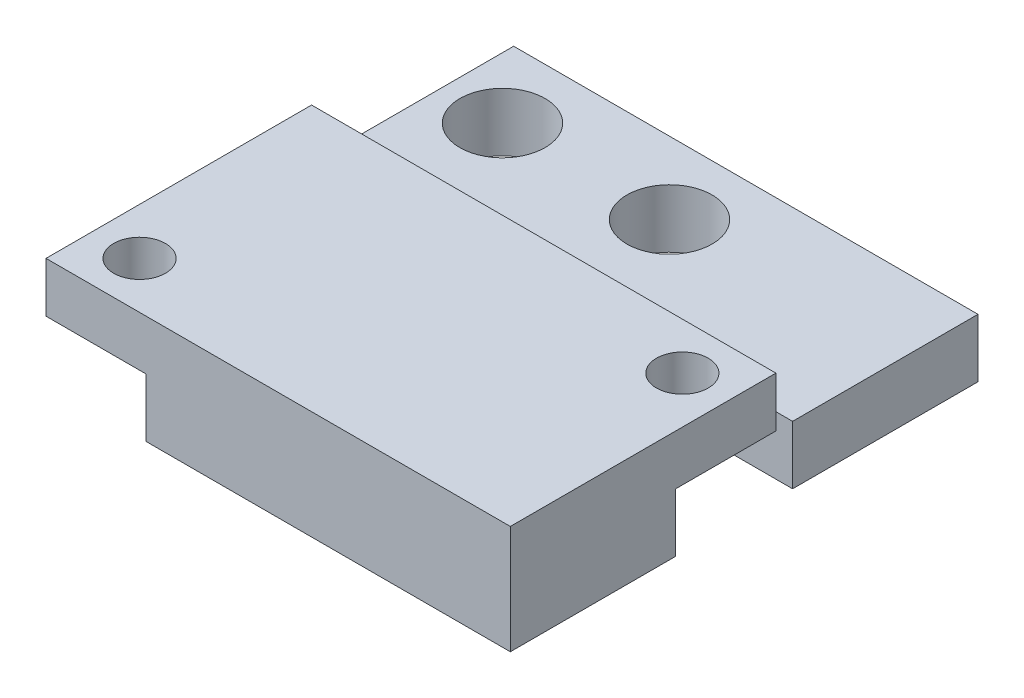
ISO-10303-21;
HEADER;
FILE_DESCRIPTION(('STEP AP214'),'2;1');
FILE_NAME('part.step','',(''),(''),'','','');
FILE_SCHEMA(('AUTOMOTIVE_DESIGN { 1 0 10303 214 1 1 1 1 }'));
ENDSEC;
DATA;
#1=APPLICATION_CONTEXT('core data for automotive mechanical design processes');
#2=APPLICATION_PROTOCOL_DEFINITION('international standard','automotive_design',2000,#1);
#3=PRODUCT_CONTEXT('',#1,'mechanical');
#4=PRODUCT('Part','Part','',(#3));
#5=PRODUCT_RELATED_PRODUCT_CATEGORY('part','',(#4));
#6=PRODUCT_DEFINITION_FORMATION('','',#4);
#7=PRODUCT_DEFINITION_CONTEXT('part definition',#1,'design');
#8=PRODUCT_DEFINITION('design','',#6,#7);
#9=PRODUCT_DEFINITION_SHAPE('','',#8);
#10=(LENGTH_UNIT() NAMED_UNIT(*) SI_UNIT(.MILLI.,.METRE.));
#11=(NAMED_UNIT(*) PLANE_ANGLE_UNIT() SI_UNIT($,.RADIAN.));
#12=(NAMED_UNIT(*) SI_UNIT($,.STERADIAN.) SOLID_ANGLE_UNIT());
#13=UNCERTAINTY_MEASURE_WITH_UNIT(LENGTH_MEASURE(1.E-05),#10,'distance_accuracy_value','');
#14=(GEOMETRIC_REPRESENTATION_CONTEXT(3) GLOBAL_UNCERTAINTY_ASSIGNED_CONTEXT((#13)) GLOBAL_UNIT_ASSIGNED_CONTEXT((#10,
#11,#12)) REPRESENTATION_CONTEXT('',''));
#15=CARTESIAN_POINT('',(0.,0.,0.));
#16=DIRECTION('',(0.,0.,1.));
#17=DIRECTION('',(1.,0.,0.));
#18=AXIS2_PLACEMENT_3D('',#15,#16,#17);
#19=CARTESIAN_POINT('',(0.,3.5,0.));
#20=DIRECTION('',(0.,-1.,0.));
#21=DIRECTION('',(0.,0.,-1.));
#22=AXIS2_PLACEMENT_3D('',#19,#20,#21);
#23=PLANE('',#22);
#24=CARTESIAN_POINT('',(3.65,3.5,-23.68));
#25=DIRECTION('',(0.,1.,0.));
#26=DIRECTION('',(0.,0.,1.));
#27=AXIS2_PLACEMENT_3D('',#24,#25,#26);
#28=CIRCLE('',#27,2.55);
#29=CARTESIAN_POINT('',(3.65,3.5,-21.13));
#30=VERTEX_POINT('',#29);
#31=EDGE_CURVE('E262',#30,#30,#28,.T.);
#32=ORIENTED_EDGE('',*,*,#31,.F.);
#33=EDGE_LOOP('',(#32));
#34=FACE_BOUND('',#33,.T.);
#35=CARTESIAN_POINT('',(13.65,3.5,-23.68));
#36=DIRECTION('',(0.,1.,0.));
#37=DIRECTION('',(0.,0.,1.));
#38=AXIS2_PLACEMENT_3D('',#35,#36,#37);
#39=CIRCLE('',#38,2.55);
#40=CARTESIAN_POINT('',(13.65,3.5,-21.13));
#41=VERTEX_POINT('',#40);
#42=EDGE_CURVE('E270',#41,#41,#39,.T.);
#43=ORIENTED_EDGE('',*,*,#42,.F.);
#44=EDGE_LOOP('',(#43));
#45=FACE_BOUND('',#44,.T.);
#46=DIRECTION('',(0.,0.,1.));
#47=VECTOR('',#46,1.);
#48=CARTESIAN_POINT('',(21.8,3.5,0.));
#49=LINE('',#48,#47);
#50=CARTESIAN_POINT('',(21.8,3.5,-16.9));
#51=VERTEX_POINT('',#50);
#52=CARTESIAN_POINT('',(21.8,3.5,-15.9));
#53=VERTEX_POINT('',#52);
#54=EDGE_CURVE('E55',#51,#53,#49,.T.);
#55=ORIENTED_EDGE('',*,*,#54,.F.);
#56=DIRECTION('',(-1.,0.,0.));
#57=VECTOR('',#56,1.);
#58=CARTESIAN_POINT('',(0.,3.5,-16.9));
#59=LINE('',#58,#57);
#60=CARTESIAN_POINT('',(27.8,3.5,-16.9));
#61=VERTEX_POINT('',#60);
#62=EDGE_CURVE('E138',#61,#51,#59,.T.);
#63=ORIENTED_EDGE('',*,*,#62,.F.);
#64=DIRECTION('',(0.,0.,-1.));
#65=VECTOR('',#64,1.);
#66=CARTESIAN_POINT('',(27.8,3.5,0.));
#67=LINE('',#66,#65);
#68=CARTESIAN_POINT('',(27.8,3.5,-28.));
#69=VERTEX_POINT('',#68);
#70=EDGE_CURVE('E281',#61,#69,#67,.T.);
#71=ORIENTED_EDGE('',*,*,#70,.T.);
#72=DIRECTION('',(-1.,0.,0.));
#73=VECTOR('',#72,1.);
#74=CARTESIAN_POINT('',(0.,3.5,-28.));
#75=LINE('',#74,#73);
#76=CARTESIAN_POINT('',(0.,3.5,-28.));
#77=VERTEX_POINT('',#76);
#78=EDGE_CURVE('E285',#69,#77,#75,.T.);
#79=ORIENTED_EDGE('',*,*,#78,.T.);
#80=DIRECTION('',(0.,0.,1.));
#81=VECTOR('',#80,1.);
#82=CARTESIAN_POINT('',(0.,3.5,0.));
#83=LINE('',#82,#81);
#84=CARTESIAN_POINT('',(0.,3.5,-15.9));
#85=VERTEX_POINT('',#84);
#86=EDGE_CURVE('E278',#77,#85,#83,.T.);
#87=ORIENTED_EDGE('',*,*,#86,.T.);
#88=DIRECTION('',(-1.,0.,0.));
#89=VECTOR('',#88,1.);
#90=CARTESIAN_POINT('',(0.,3.5,-15.9));
#91=LINE('',#90,#89);
#92=EDGE_CURVE('E158',#53,#85,#91,.T.);
#93=ORIENTED_EDGE('',*,*,#92,.F.);
#94=EDGE_LOOP('',(#55,#63,#71,#79,#87,#93));
#95=FACE_BOUND('',#94,.T.);
#96=ADVANCED_FACE('F39',(#34,#45,#95),#23,.F.);
#97=CARTESIAN_POINT('',(27.8,3.5,0.));
#98=DIRECTION('',(-1.,0.,0.));
#99=DIRECTION('',(0.,0.,1.));
#100=AXIS2_PLACEMENT_3D('',#97,#98,#99);
#101=PLANE('',#100);
#102=DIRECTION('',(0.,-1.,0.));
#103=VECTOR('',#102,1.);
#104=CARTESIAN_POINT('',(27.8,3.5,-16.9));
#105=LINE('',#104,#103);
#106=CARTESIAN_POINT('',(27.8,0.,-16.9));
#107=VERTEX_POINT('',#106);
#108=EDGE_CURVE('E143',#61,#107,#105,.T.);
#109=ORIENTED_EDGE('',*,*,#108,.T.);
#110=DIRECTION('',(0.,0.,-1.));
#111=VECTOR('',#110,1.);
#112=CARTESIAN_POINT('',(27.8,0.,0.));
#113=LINE('',#112,#111);
#114=CARTESIAN_POINT('',(27.8,0.,-28.));
#115=VERTEX_POINT('',#114);
#116=EDGE_CURVE('E295',#107,#115,#113,.T.);
#117=ORIENTED_EDGE('',*,*,#116,.T.);
#118=DIRECTION('',(0.,-1.,0.));
#119=VECTOR('',#118,1.);
#120=CARTESIAN_POINT('',(27.8,3.5,-28.));
#121=LINE('',#120,#119);
#122=EDGE_CURVE('E305',#69,#115,#121,.T.);
#123=ORIENTED_EDGE('',*,*,#122,.F.);
#124=ORIENTED_EDGE('',*,*,#70,.F.);
#125=EDGE_LOOP('',(#109,#117,#123,#124));
#126=FACE_BOUND('',#125,.T.);
#127=ADVANCED_FACE('F363',(#126),#101,.F.);
#128=CARTESIAN_POINT('',(0.,0.,0.));
#129=DIRECTION('',(0.,-1.,0.));
#130=DIRECTION('',(0.,0.,-1.));
#131=AXIS2_PLACEMENT_3D('',#128,#129,#130);
#132=PLANE('',#131);
#133=CARTESIAN_POINT('',(13.65,0.,-13.68));
#134=DIRECTION('',(0.,-1.,0.));
#135=DIRECTION('',(0.,0.,-1.));
#136=AXIS2_PLACEMENT_3D('',#133,#134,#135);
#137=CIRCLE('',#136,5.);
#138=CARTESIAN_POINT('',(13.65,0.,-18.68));
#139=VERTEX_POINT('',#138);
#140=EDGE_CURVE('E166',#139,#139,#137,.T.);
#141=ORIENTED_EDGE('',*,*,#140,.F.);
#142=EDGE_LOOP('',(#141));
#143=FACE_BOUND('',#142,.T.);
#144=DIRECTION('',(-1.,0.,0.));
#145=VECTOR('',#144,1.);
#146=CARTESIAN_POINT('',(0.,0.,-9.9));
#147=LINE('',#146,#145);
#148=CARTESIAN_POINT('',(27.8,0.,-9.9));
#149=VERTEX_POINT('',#148);
#150=CARTESIAN_POINT('',(21.8,0.,-9.9));
#151=VERTEX_POINT('',#150);
#152=EDGE_CURVE('E164',#149,#151,#147,.T.);
#153=ORIENTED_EDGE('',*,*,#152,.F.);
#154=CARTESIAN_POINT('',(27.8,0.,0.));
#155=VERTEX_POINT('',#154);
#156=EDGE_CURVE('E296',#155,#149,#113,.T.);
#157=ORIENTED_EDGE('',*,*,#156,.F.);
#158=DIRECTION('',(1.,0.,0.));
#159=VECTOR('',#158,1.);
#160=CARTESIAN_POINT('',(0.,0.,0.));
#161=LINE('',#160,#159);
#162=CARTESIAN_POINT('',(6.,0.,0.));
#163=VERTEX_POINT('',#162);
#164=EDGE_CURVE('E292',#163,#155,#161,.T.);
#165=ORIENTED_EDGE('',*,*,#164,.F.);
#166=DIRECTION('',(0.,0.,-1.));
#167=VECTOR('',#166,1.);
#168=CARTESIAN_POINT('',(6.,0.,0.));
#169=LINE('',#168,#167);
#170=CARTESIAN_POINT('',(6.,0.,-6.));
#171=VERTEX_POINT('',#170);
#172=EDGE_CURVE('E205',#163,#171,#169,.T.);
#173=ORIENTED_EDGE('',*,*,#172,.T.);
#174=DIRECTION('',(1.,0.,0.));
#175=VECTOR('',#174,1.);
#176=CARTESIAN_POINT('',(0.,0.,-6.));
#177=LINE('',#176,#175);
#178=CARTESIAN_POINT('',(0.,0.,-6.));
#179=VERTEX_POINT('',#178);
#180=EDGE_CURVE('E195',#179,#171,#177,.T.);
#181=ORIENTED_EDGE('',*,*,#180,.F.);
#182=DIRECTION('',(0.,0.,1.));
#183=VECTOR('',#182,1.);
#184=CARTESIAN_POINT('',(0.,0.,0.));
#185=LINE('',#184,#183);
#186=CARTESIAN_POINT('',(0.,0.,-28.));
#187=VERTEX_POINT('',#186);
#188=EDGE_CURVE('E274',#187,#179,#185,.T.);
#189=ORIENTED_EDGE('',*,*,#188,.F.);
#190=DIRECTION('',(-1.,0.,0.));
#191=VECTOR('',#190,1.);
#192=CARTESIAN_POINT('',(0.,0.,-28.));
#193=LINE('',#192,#191);
#194=EDGE_CURVE('E282',#115,#187,#193,.T.);
#195=ORIENTED_EDGE('',*,*,#194,.F.);
#196=ORIENTED_EDGE('',*,*,#116,.F.);
#197=DIRECTION('',(-1.,0.,0.));
#198=VECTOR('',#197,1.);
#199=CARTESIAN_POINT('',(0.,0.,-16.9));
#200=LINE('',#199,#198);
#201=CARTESIAN_POINT('',(21.8,0.,-16.9));
#202=VERTEX_POINT('',#201);
#203=EDGE_CURVE('E176',#107,#202,#200,.T.);
#204=ORIENTED_EDGE('',*,*,#203,.T.);
#205=DIRECTION('',(0.,0.,1.));
#206=VECTOR('',#205,1.);
#207=CARTESIAN_POINT('',(21.8,0.,0.));
#208=LINE('',#207,#206);
#209=EDGE_CURVE('E151',#202,#151,#208,.T.);
#210=ORIENTED_EDGE('',*,*,#209,.T.);
#211=EDGE_LOOP('',(#153,#157,#165,#173,#181,#189,#195,#196,#204,#210));
#212=FACE_BOUND('',#211,.T.);
#213=CARTESIAN_POINT('',(13.65,0.,-23.68));
#214=DIRECTION('',(0.,1.,0.));
#215=DIRECTION('',(0.,0.,1.));
#216=AXIS2_PLACEMENT_3D('',#213,#214,#215);
#217=CIRCLE('',#216,2.55);
#218=CARTESIAN_POINT('',(13.65,0.,-21.13));
#219=VERTEX_POINT('',#218);
#220=EDGE_CURVE('E266',#219,#219,#217,.T.);
#221=ORIENTED_EDGE('',*,*,#220,.T.);
#222=EDGE_LOOP('',(#221));
#223=FACE_BOUND('',#222,.T.);
#224=CARTESIAN_POINT('',(3.65,0.,-23.68));
#225=DIRECTION('',(0.,1.,0.));
#226=DIRECTION('',(0.,0.,1.));
#227=AXIS2_PLACEMENT_3D('',#224,#225,#226);
#228=CIRCLE('',#227,2.55);
#229=CARTESIAN_POINT('',(3.65,0.,-21.13));
#230=VERTEX_POINT('',#229);
#231=EDGE_CURVE('E261',#230,#230,#228,.T.);
#232=ORIENTED_EDGE('',*,*,#231,.T.);
#233=EDGE_LOOP('',(#232));
#234=FACE_BOUND('',#233,.T.);
#235=ADVANCED_FACE('F321',(#143,#212,#223,#234),#132,.T.);
#236=CARTESIAN_POINT('',(0.,3.5,0.));
#237=DIRECTION('',(0.,0.,-1.));
#238=DIRECTION('',(-1.,0.,0.));
#239=AXIS2_PLACEMENT_3D('',#236,#237,#238);
#240=PLANE('',#239);
#241=DIRECTION('',(0.,-1.,0.));
#242=VECTOR('',#241,1.);
#243=CARTESIAN_POINT('',(6.,3.5,0.));
#244=LINE('',#243,#242);
#245=CARTESIAN_POINT('',(6.,3.5,0.));
#246=VERTEX_POINT('',#245);
#247=EDGE_CURVE('E204',#246,#163,#244,.T.);
#248=ORIENTED_EDGE('',*,*,#247,.T.);
#249=ORIENTED_EDGE('',*,*,#164,.T.);
#250=DIRECTION('',(0.,-1.,0.));
#251=VECTOR('',#250,1.);
#252=CARTESIAN_POINT('',(27.8,3.5,0.));
#253=LINE('',#252,#251);
#254=CARTESIAN_POINT('',(27.8,6.5,0.));
#255=VERTEX_POINT('',#254);
#256=EDGE_CURVE('E48',#255,#155,#253,.T.);
#257=ORIENTED_EDGE('',*,*,#256,.F.);
#258=DIRECTION('',(1.,0.,0.));
#259=VECTOR('',#258,1.);
#260=CARTESIAN_POINT('',(0.,6.5,0.));
#261=LINE('',#260,#259);
#262=CARTESIAN_POINT('',(0.,6.5,0.));
#263=VERTEX_POINT('',#262);
#264=EDGE_CURVE('E240',#263,#255,#261,.T.);
#265=ORIENTED_EDGE('',*,*,#264,.F.);
#266=DIRECTION('',(0.,-1.,0.));
#267=VECTOR('',#266,1.);
#268=CARTESIAN_POINT('',(0.,3.5,0.));
#269=LINE('',#268,#267);
#270=CARTESIAN_POINT('',(0.,3.5,0.));
#271=VERTEX_POINT('',#270);
#272=EDGE_CURVE('E11',#263,#271,#269,.T.);
#273=ORIENTED_EDGE('',*,*,#272,.T.);
#274=DIRECTION('',(-1.,0.,0.));
#275=VECTOR('',#274,1.);
#276=CARTESIAN_POINT('',(0.,3.5,0.));
#277=LINE('',#276,#275);
#278=EDGE_CURVE('E194',#246,#271,#277,.T.);
#279=ORIENTED_EDGE('',*,*,#278,.F.);
#280=EDGE_LOOP('',(#248,#249,#257,#265,#273,#279));
#281=FACE_BOUND('',#280,.T.);
#282=ADVANCED_FACE('F337',(#281),#240,.F.);
#283=CARTESIAN_POINT('',(0.,3.5,0.));
#284=DIRECTION('',(1.,0.,0.));
#285=DIRECTION('',(0.,0.,-1.));
#286=AXIS2_PLACEMENT_3D('',#283,#284,#285);
#287=PLANE('',#286);
#288=ORIENTED_EDGE('',*,*,#188,.T.);
#289=DIRECTION('',(0.,-1.,0.));
#290=VECTOR('',#289,1.);
#291=CARTESIAN_POINT('',(0.,3.5,-6.));
#292=LINE('',#291,#290);
#293=CARTESIAN_POINT('',(0.,3.5,-6.));
#294=VERTEX_POINT('',#293);
#295=EDGE_CURVE('E216',#294,#179,#292,.T.);
#296=ORIENTED_EDGE('',*,*,#295,.F.);
#297=DIRECTION('',(0.,0.,-1.));
#298=VECTOR('',#297,1.);
#299=CARTESIAN_POINT('',(0.,3.5,0.));
#300=LINE('',#299,#298);
#301=EDGE_CURVE('E198',#271,#294,#300,.T.);
#302=ORIENTED_EDGE('',*,*,#301,.F.);
#303=ORIENTED_EDGE('',*,*,#272,.F.);
#304=DIRECTION('',(0.,0.,1.));
#305=VECTOR('',#304,1.);
#306=CARTESIAN_POINT('',(0.,6.5,0.));
#307=LINE('',#306,#305);
#308=CARTESIAN_POINT('',(0.,6.5,-15.9));
#309=VERTEX_POINT('',#308);
#310=EDGE_CURVE('E236',#309,#263,#307,.T.);
#311=ORIENTED_EDGE('',*,*,#310,.F.);
#312=DIRECTION('',(0.,-1.,0.));
#313=VECTOR('',#312,1.);
#314=CARTESIAN_POINT('',(0.,6.5,-15.9));
#315=LINE('',#314,#313);
#316=EDGE_CURVE('E251',#309,#85,#315,.T.);
#317=ORIENTED_EDGE('',*,*,#316,.T.);
#318=ORIENTED_EDGE('',*,*,#86,.F.);
#319=DIRECTION('',(0.,-1.,0.));
#320=VECTOR('',#319,1.);
#321=CARTESIAN_POINT('',(0.,3.5,-28.));
#322=LINE('',#321,#320);
#323=EDGE_CURVE('E288',#77,#187,#322,.T.);
#324=ORIENTED_EDGE('',*,*,#323,.T.);
#325=EDGE_LOOP('',(#288,#296,#302,#303,#311,#317,#318,#324));
#326=FACE_BOUND('',#325,.T.);
#327=ADVANCED_FACE('F41',(#326),#287,.F.);
#328=ORIENTED_EDGE('',*,*,#156,.T.);
#329=DIRECTION('',(0.,-1.,0.));
#330=VECTOR('',#329,1.);
#331=CARTESIAN_POINT('',(27.8,3.5,-9.9));
#332=LINE('',#331,#330);
#333=CARTESIAN_POINT('',(27.8,3.5,-9.9));
#334=VERTEX_POINT('',#333);
#335=EDGE_CURVE('E187',#334,#149,#332,.T.);
#336=ORIENTED_EDGE('',*,*,#335,.F.);
#337=DIRECTION('',(0.,0.,1.));
#338=VECTOR('',#337,1.);
#339=CARTESIAN_POINT('',(27.8,3.5,0.));
#340=LINE('',#339,#338);
#341=CARTESIAN_POINT('',(27.8,3.5,-15.9));
#342=VERTEX_POINT('',#341);
#343=EDGE_CURVE('E147',#342,#334,#340,.T.);
#344=ORIENTED_EDGE('',*,*,#343,.F.);
#345=DIRECTION('',(0.,-1.,0.));
#346=VECTOR('',#345,1.);
#347=CARTESIAN_POINT('',(27.8,6.5,-15.9));
#348=LINE('',#347,#346);
#349=CARTESIAN_POINT('',(27.8,6.5,-15.9));
#350=VERTEX_POINT('',#349);
#351=EDGE_CURVE('E257',#350,#342,#348,.T.);
#352=ORIENTED_EDGE('',*,*,#351,.F.);
#353=DIRECTION('',(0.,0.,-1.));
#354=VECTOR('',#353,1.);
#355=CARTESIAN_POINT('',(27.8,6.5,0.));
#356=LINE('',#355,#354);
#357=EDGE_CURVE('E245',#255,#350,#356,.T.);
#358=ORIENTED_EDGE('',*,*,#357,.F.);
#359=ORIENTED_EDGE('',*,*,#256,.T.);
#360=EDGE_LOOP('',(#328,#336,#344,#352,#358,#359));
#361=FACE_BOUND('',#360,.T.);
#362=ADVANCED_FACE('F313',(#361),#101,.F.);
#363=CARTESIAN_POINT('',(0.,3.5,-28.));
#364=DIRECTION('',(0.,0.,1.));
#365=DIRECTION('',(1.,0.,0.));
#366=AXIS2_PLACEMENT_3D('',#363,#364,#365);
#367=PLANE('',#366);
#368=ORIENTED_EDGE('',*,*,#194,.T.);
#369=ORIENTED_EDGE('',*,*,#323,.F.);
#370=ORIENTED_EDGE('',*,*,#78,.F.);
#371=ORIENTED_EDGE('',*,*,#122,.T.);
#372=EDGE_LOOP('',(#368,#369,#370,#371));
#373=FACE_BOUND('',#372,.T.);
#374=ADVANCED_FACE('F357',(#373),#367,.F.);
#375=CARTESIAN_POINT('',(13.65,3.5,-23.68));
#376=DIRECTION('',(0.,-1.,0.));
#377=DIRECTION('',(0.,0.,-1.));
#378=AXIS2_PLACEMENT_3D('',#375,#376,#377);
#379=CYLINDRICAL_SURFACE('',#378,2.55);
#380=ORIENTED_EDGE('',*,*,#220,.F.);
#381=EDGE_LOOP('',(#380));
#382=FACE_BOUND('',#381,.T.);
#383=ORIENTED_EDGE('',*,*,#42,.T.);
#384=EDGE_LOOP('',(#383));
#385=FACE_BOUND('',#384,.T.);
#386=ADVANCED_FACE('F380',(#382,#385),#379,.F.);
#387=CARTESIAN_POINT('',(3.65,3.5,-23.68));
#388=DIRECTION('',(0.,-1.,0.));
#389=DIRECTION('',(0.,0.,-1.));
#390=AXIS2_PLACEMENT_3D('',#387,#388,#389);
#391=CYLINDRICAL_SURFACE('',#390,2.55);
#392=ORIENTED_EDGE('',*,*,#31,.T.);
#393=EDGE_LOOP('',(#392));
#394=FACE_BOUND('',#393,.T.);
#395=ORIENTED_EDGE('',*,*,#231,.F.);
#396=EDGE_LOOP('',(#395));
#397=FACE_BOUND('',#396,.T.);
#398=ADVANCED_FACE('F406',(#394,#397),#391,.F.);
#399=CARTESIAN_POINT('',(0.,6.5,0.));
#400=DIRECTION('',(0.,-1.,0.));
#401=DIRECTION('',(0.,0.,-1.));
#402=AXIS2_PLACEMENT_3D('',#399,#400,#401);
#403=PLANE('',#402);
#404=ORIENTED_EDGE('',*,*,#310,.T.);
#405=ORIENTED_EDGE('',*,*,#264,.T.);
#406=ORIENTED_EDGE('',*,*,#357,.T.);
#407=DIRECTION('',(-1.,0.,0.));
#408=VECTOR('',#407,1.);
#409=CARTESIAN_POINT('',(0.,6.5,-15.9));
#410=LINE('',#409,#408);
#411=EDGE_CURVE('E248',#350,#309,#410,.T.);
#412=ORIENTED_EDGE('',*,*,#411,.T.);
#413=EDGE_LOOP('',(#404,#405,#406,#412));
#414=FACE_BOUND('',#413,.T.);
#415=CARTESIAN_POINT('',(2.8,6.5,-2.8));
#416=DIRECTION('',(0.,1.,0.));
#417=DIRECTION('',(0.,0.,1.));
#418=AXIS2_PLACEMENT_3D('',#415,#416,#417);
#419=CIRCLE('',#418,1.55);
#420=CARTESIAN_POINT('',(2.8,6.5,-1.25));
#421=VERTEX_POINT('',#420);
#422=EDGE_CURVE('E226',#421,#421,#419,.T.);
#423=ORIENTED_EDGE('',*,*,#422,.F.);
#424=EDGE_LOOP('',(#423));
#425=FACE_BOUND('',#424,.T.);
#426=CARTESIAN_POINT('',(25.,6.5,-13.1));
#427=DIRECTION('',(0.,1.,0.));
#428=DIRECTION('',(0.,0.,1.));
#429=AXIS2_PLACEMENT_3D('',#426,#427,#428);
#430=CIRCLE('',#429,1.55);
#431=CARTESIAN_POINT('',(25.,6.5,-11.55));
#432=VERTEX_POINT('',#431);
#433=EDGE_CURVE('E222',#432,#432,#430,.T.);
#434=ORIENTED_EDGE('',*,*,#433,.F.);
#435=EDGE_LOOP('',(#434));
#436=FACE_BOUND('',#435,.T.);
#437=ADVANCED_FACE('F335',(#414,#425,#436),#403,.F.);
#438=CARTESIAN_POINT('',(0.,6.5,-15.9));
#439=DIRECTION('',(0.,0.,1.));
#440=DIRECTION('',(1.,0.,0.));
#441=AXIS2_PLACEMENT_3D('',#438,#439,#440);
#442=PLANE('',#441);
#443=EDGE_CURVE('E241',#342,#53,#91,.T.);
#444=ORIENTED_EDGE('',*,*,#443,.T.);
#445=ORIENTED_EDGE('',*,*,#92,.T.);
#446=ORIENTED_EDGE('',*,*,#316,.F.);
#447=ORIENTED_EDGE('',*,*,#411,.F.);
#448=ORIENTED_EDGE('',*,*,#351,.T.);
#449=EDGE_LOOP('',(#444,#445,#446,#447,#448));
#450=FACE_BOUND('',#449,.T.);
#451=ADVANCED_FACE('F331',(#450),#442,.F.);
#452=CARTESIAN_POINT('',(2.8,6.5,-2.8));
#453=DIRECTION('',(0.,-1.,0.));
#454=DIRECTION('',(0.,0.,-1.));
#455=AXIS2_PLACEMENT_3D('',#452,#453,#454);
#456=CYLINDRICAL_SURFACE('',#455,1.55);
#457=ORIENTED_EDGE('',*,*,#422,.T.);
#458=EDGE_LOOP('',(#457));
#459=FACE_BOUND('',#458,.T.);
#460=CARTESIAN_POINT('',(2.8,3.5,-2.8));
#461=DIRECTION('',(0.,1.,0.));
#462=DIRECTION('',(0.,0.,1.));
#463=AXIS2_PLACEMENT_3D('',#460,#461,#462);
#464=CIRCLE('',#463,1.55);
#465=CARTESIAN_POINT('',(2.8,3.5,-1.25));
#466=VERTEX_POINT('',#465);
#467=EDGE_CURVE('E215',#466,#466,#464,.T.);
#468=ORIENTED_EDGE('',*,*,#467,.F.);
#469=EDGE_LOOP('',(#468));
#470=FACE_BOUND('',#469,.T.);
#471=ADVANCED_FACE('F453',(#459,#470),#456,.F.);
#472=CARTESIAN_POINT('',(25.,6.5,-13.1));
#473=DIRECTION('',(0.,-1.,0.));
#474=DIRECTION('',(0.,0.,-1.));
#475=AXIS2_PLACEMENT_3D('',#472,#473,#474);
#476=CYLINDRICAL_SURFACE('',#475,1.55);
#477=ORIENTED_EDGE('',*,*,#433,.T.);
#478=EDGE_LOOP('',(#477));
#479=FACE_BOUND('',#478,.T.);
#480=CARTESIAN_POINT('',(25.,3.5,-13.1));
#481=DIRECTION('',(0.,1.,0.));
#482=DIRECTION('',(0.,0.,1.));
#483=AXIS2_PLACEMENT_3D('',#480,#481,#482);
#484=CIRCLE('',#483,1.55);
#485=CARTESIAN_POINT('',(25.,3.5,-11.55));
#486=VERTEX_POINT('',#485);
#487=EDGE_CURVE('E186',#486,#486,#484,.T.);
#488=ORIENTED_EDGE('',*,*,#487,.F.);
#489=EDGE_LOOP('',(#488));
#490=FACE_BOUND('',#489,.T.);
#491=ADVANCED_FACE('F446',(#479,#490),#476,.F.);
#492=CARTESIAN_POINT('',(0.,3.5,0.));
#493=DIRECTION('',(0.,-1.,0.));
#494=DIRECTION('',(0.,0.,-1.));
#495=AXIS2_PLACEMENT_3D('',#492,#493,#494);
#496=PLANE('',#495);
#497=DIRECTION('',(0.,0.,-1.));
#498=VECTOR('',#497,1.);
#499=CARTESIAN_POINT('',(6.,3.5,0.));
#500=LINE('',#499,#498);
#501=CARTESIAN_POINT('',(6.,3.5,-6.));
#502=VERTEX_POINT('',#501);
#503=EDGE_CURVE('E63',#246,#502,#500,.T.);
#504=ORIENTED_EDGE('',*,*,#503,.F.);
#505=ORIENTED_EDGE('',*,*,#278,.T.);
#506=ORIENTED_EDGE('',*,*,#301,.T.);
#507=DIRECTION('',(1.,0.,0.));
#508=VECTOR('',#507,1.);
#509=CARTESIAN_POINT('',(0.,3.5,-6.));
#510=LINE('',#509,#508);
#511=EDGE_CURVE('E201',#294,#502,#510,.T.);
#512=ORIENTED_EDGE('',*,*,#511,.T.);
#513=EDGE_LOOP('',(#504,#505,#506,#512));
#514=FACE_BOUND('',#513,.T.);
#515=ORIENTED_EDGE('',*,*,#467,.T.);
#516=EDGE_LOOP('',(#515));
#517=FACE_BOUND('',#516,.T.);
#518=ADVANCED_FACE('F343',(#514,#517),#496,.T.);
#519=CARTESIAN_POINT('',(6.,3.5,0.));
#520=DIRECTION('',(-1.,0.,0.));
#521=DIRECTION('',(0.,0.,1.));
#522=AXIS2_PLACEMENT_3D('',#519,#520,#521);
#523=PLANE('',#522);
#524=ORIENTED_EDGE('',*,*,#172,.F.);
#525=ORIENTED_EDGE('',*,*,#247,.F.);
#526=ORIENTED_EDGE('',*,*,#503,.T.);
#527=DIRECTION('',(0.,-1.,0.));
#528=VECTOR('',#527,1.);
#529=CARTESIAN_POINT('',(6.,3.5,-6.));
#530=LINE('',#529,#528);
#531=EDGE_CURVE('E212',#502,#171,#530,.T.);
#532=ORIENTED_EDGE('',*,*,#531,.T.);
#533=EDGE_LOOP('',(#524,#525,#526,#532));
#534=FACE_BOUND('',#533,.T.);
#535=ADVANCED_FACE('F350',(#534),#523,.T.);
#536=CARTESIAN_POINT('',(0.,3.5,-6.));
#537=DIRECTION('',(0.,0.,-1.));
#538=DIRECTION('',(-1.,0.,0.));
#539=AXIS2_PLACEMENT_3D('',#536,#537,#538);
#540=PLANE('',#539);
#541=ORIENTED_EDGE('',*,*,#180,.T.);
#542=ORIENTED_EDGE('',*,*,#531,.F.);
#543=ORIENTED_EDGE('',*,*,#511,.F.);
#544=ORIENTED_EDGE('',*,*,#295,.T.);
#545=EDGE_LOOP('',(#541,#542,#543,#544));
#546=FACE_BOUND('',#545,.T.);
#547=ADVANCED_FACE('F347',(#546),#540,.F.);
#548=CARTESIAN_POINT('',(0.,3.5,0.));
#549=DIRECTION('',(0.,-1.,0.));
#550=DIRECTION('',(0.,0.,-1.));
#551=AXIS2_PLACEMENT_3D('',#548,#549,#550);
#552=PLANE('',#551);
#553=ORIENTED_EDGE('',*,*,#443,.F.);
#554=ORIENTED_EDGE('',*,*,#343,.T.);
#555=DIRECTION('',(-1.,0.,0.));
#556=VECTOR('',#555,1.);
#557=CARTESIAN_POINT('',(0.,3.5,-9.9));
#558=LINE('',#557,#556);
#559=CARTESIAN_POINT('',(21.8,3.5,-9.9));
#560=VERTEX_POINT('',#559);
#561=EDGE_CURVE('E154',#334,#560,#558,.T.);
#562=ORIENTED_EDGE('',*,*,#561,.T.);
#563=EDGE_CURVE('E161',#53,#560,#49,.T.);
#564=ORIENTED_EDGE('',*,*,#563,.F.);
#565=EDGE_LOOP('',(#553,#554,#562,#564));
#566=FACE_BOUND('',#565,.T.);
#567=ORIENTED_EDGE('',*,*,#487,.T.);
#568=EDGE_LOOP('',(#567));
#569=FACE_BOUND('',#568,.T.);
#570=ADVANCED_FACE('F436',(#566,#569),#552,.T.);
#571=CARTESIAN_POINT('',(21.8,3.5,0.));
#572=DIRECTION('',(1.,0.,0.));
#573=DIRECTION('',(0.,0.,-1.));
#574=AXIS2_PLACEMENT_3D('',#571,#572,#573);
#575=PLANE('',#574);
#576=ORIENTED_EDGE('',*,*,#209,.F.);
#577=DIRECTION('',(0.,-1.,0.));
#578=VECTOR('',#577,1.);
#579=CARTESIAN_POINT('',(21.8,3.5,-16.9));
#580=LINE('',#579,#578);
#581=EDGE_CURVE('E140',#51,#202,#580,.T.);
#582=ORIENTED_EDGE('',*,*,#581,.F.);
#583=ORIENTED_EDGE('',*,*,#54,.T.);
#584=ORIENTED_EDGE('',*,*,#563,.T.);
#585=DIRECTION('',(0.,-1.,0.));
#586=VECTOR('',#585,1.);
#587=CARTESIAN_POINT('',(21.8,3.5,-9.9));
#588=LINE('',#587,#586);
#589=EDGE_CURVE('E183',#560,#151,#588,.T.);
#590=ORIENTED_EDGE('',*,*,#589,.T.);
#591=EDGE_LOOP('',(#576,#582,#583,#584,#590));
#592=FACE_BOUND('',#591,.T.);
#593=ADVANCED_FACE('F149',(#592),#575,.T.);
#594=CARTESIAN_POINT('',(0.,3.5,-9.9));
#595=DIRECTION('',(0.,0.,1.));
#596=DIRECTION('',(1.,0.,0.));
#597=AXIS2_PLACEMENT_3D('',#594,#595,#596);
#598=PLANE('',#597);
#599=ORIENTED_EDGE('',*,*,#152,.T.);
#600=ORIENTED_EDGE('',*,*,#589,.F.);
#601=ORIENTED_EDGE('',*,*,#561,.F.);
#602=ORIENTED_EDGE('',*,*,#335,.T.);
#603=EDGE_LOOP('',(#599,#600,#601,#602));
#604=FACE_BOUND('',#603,.T.);
#605=ADVANCED_FACE('F325',(#604),#598,.F.);
#606=CARTESIAN_POINT('',(0.,3.5,-16.9));
#607=DIRECTION('',(0.,0.,1.));
#608=DIRECTION('',(1.,0.,0.));
#609=AXIS2_PLACEMENT_3D('',#606,#607,#608);
#610=PLANE('',#609);
#611=ORIENTED_EDGE('',*,*,#203,.F.);
#612=ORIENTED_EDGE('',*,*,#108,.F.);
#613=ORIENTED_EDGE('',*,*,#62,.T.);
#614=ORIENTED_EDGE('',*,*,#581,.T.);
#615=EDGE_LOOP('',(#611,#612,#613,#614));
#616=FACE_BOUND('',#615,.T.);
#617=ADVANCED_FACE('F139',(#616),#610,.T.);
#618=CARTESIAN_POINT('',(13.65,3.,-13.68));
#619=DIRECTION('',(0.,-1.,0.));
#620=DIRECTION('',(0.,0.,-1.));
#621=AXIS2_PLACEMENT_3D('',#618,#619,#620);
#622=CYLINDRICAL_SURFACE('',#621,5.);
#623=CARTESIAN_POINT('',(13.65,3.,-13.68));
#624=DIRECTION('',(0.,-1.,0.));
#625=DIRECTION('',(0.,0.,-1.));
#626=AXIS2_PLACEMENT_3D('',#623,#624,#625);
#627=CIRCLE('',#626,5.);
#628=CARTESIAN_POINT('',(13.65,3.,-18.68));
#629=VERTEX_POINT('',#628);
#630=EDGE_CURVE('E177',#629,#629,#627,.T.);
#631=ORIENTED_EDGE('',*,*,#630,.F.);
#632=EDGE_LOOP('',(#631));
#633=FACE_BOUND('',#632,.T.);
#634=ORIENTED_EDGE('',*,*,#140,.T.);
#635=EDGE_LOOP('',(#634));
#636=FACE_BOUND('',#635,.T.);
#637=ADVANCED_FACE('F415',(#633,#636),#622,.F.);
#638=CARTESIAN_POINT('',(13.65,3.,-13.68));
#639=DIRECTION('',(0.,-1.,0.));
#640=DIRECTION('',(0.,0.,-1.));
#641=AXIS2_PLACEMENT_3D('',#638,#639,#640);
#642=PLANE('',#641);
#643=ORIENTED_EDGE('',*,*,#630,.T.);
#644=EDGE_LOOP('',(#643));
#645=FACE_BOUND('',#644,.T.);
#646=ADVANCED_FACE('F420',(#645),#642,.T.);
#647=CLOSED_SHELL('',(#96,#127,#235,#282,#327,#362,#374,#386,#398,#437,#451,#471,#491,#518,#535,
#547,#570,#593,#605,#617,#637,#646));
#648=MANIFOLD_SOLID_BREP('B2',#647);
#649=ADVANCED_BREP_SHAPE_REPRESENTATION('',(#18,#648),#14);
#650=SHAPE_DEFINITION_REPRESENTATION(#9,#649);
ENDSEC;
END-ISO-10303-21;
